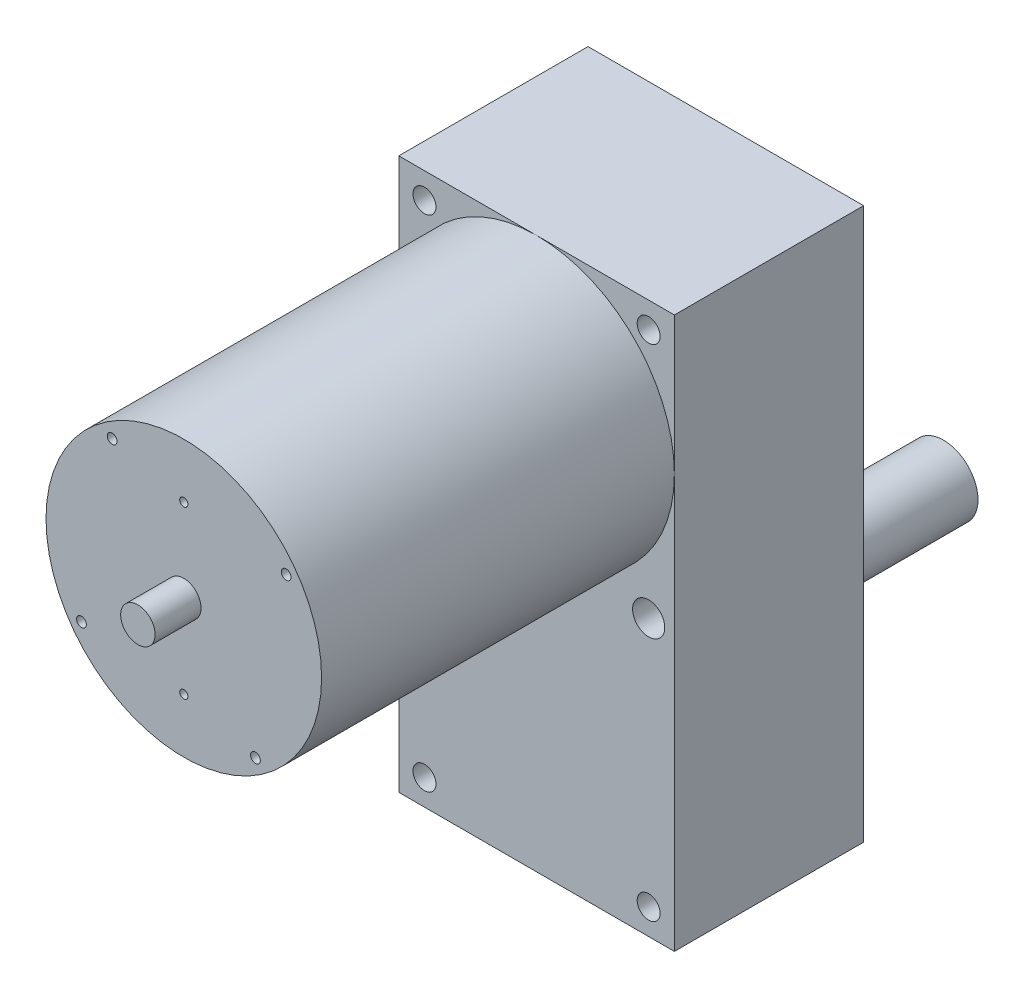
ISO-10303-21;
HEADER;
FILE_DESCRIPTION(('STEP AP214'),'2;1');
FILE_NAME('part.step','',(''),(''),'','','');
FILE_SCHEMA(('AUTOMOTIVE_DESIGN { 1 0 10303 214 1 1 1 1 }'));
ENDSEC;
DATA;
#1=APPLICATION_CONTEXT('core data for automotive mechanical design processes');
#2=APPLICATION_PROTOCOL_DEFINITION('international standard','automotive_design',2000,#1);
#3=PRODUCT_CONTEXT('',#1,'mechanical');
#4=PRODUCT('Part','Part','',(#3));
#5=PRODUCT_RELATED_PRODUCT_CATEGORY('part','',(#4));
#6=PRODUCT_DEFINITION_FORMATION('','',#4);
#7=PRODUCT_DEFINITION_CONTEXT('part definition',#1,'design');
#8=PRODUCT_DEFINITION('design','',#6,#7);
#9=PRODUCT_DEFINITION_SHAPE('','',#8);
#10=(LENGTH_UNIT() NAMED_UNIT(*) SI_UNIT(.MILLI.,.METRE.));
#11=(NAMED_UNIT(*) PLANE_ANGLE_UNIT() SI_UNIT($,.RADIAN.));
#12=(NAMED_UNIT(*) SI_UNIT($,.STERADIAN.) SOLID_ANGLE_UNIT());
#13=UNCERTAINTY_MEASURE_WITH_UNIT(LENGTH_MEASURE(1.E-05),#10,'distance_accuracy_value','');
#14=(GEOMETRIC_REPRESENTATION_CONTEXT(3) GLOBAL_UNCERTAINTY_ASSIGNED_CONTEXT((#13)) GLOBAL_UNIT_ASSIGNED_CONTEXT((#10,
#11,#12)) REPRESENTATION_CONTEXT('',''));
#15=CARTESIAN_POINT('',(0.,0.,0.));
#16=DIRECTION('',(0.,0.,1.));
#17=DIRECTION('',(1.,0.,0.));
#18=AXIS2_PLACEMENT_3D('',#15,#16,#17);
#19=CARTESIAN_POINT('',(0.,38.1000000000001,149.86));
#20=DIRECTION('',(0.,0.,1.));
#21=DIRECTION('',(1.,0.,0.));
#22=AXIS2_PLACEMENT_3D('',#19,#20,#21);
#23=PLANE('',#22);
#24=CARTESIAN_POINT('',(28.296788217919,57.9136244173105,149.86));
#25=DIRECTION('',(0.,0.,1.));
#26=DIRECTION('',(1.,0.,0.));
#27=AXIS2_PLACEMENT_3D('',#24,#25,#26);
#28=CIRCLE('',#27,1.35255);
#29=CARTESIAN_POINT('',(29.649338217919,57.9136244173105,149.86));
#30=VERTEX_POINT('',#29);
#31=EDGE_CURVE('E138',#30,#30,#28,.T.);
#32=ORIENTED_EDGE('',*,*,#31,.F.);
#33=EDGE_LOOP('',(#32));
#34=FACE_BOUND('',#33,.T.);
#35=CARTESIAN_POINT('',(19.8136244173104,9.80321178208109,149.86));
#36=DIRECTION('',(0.,0.,1.));
#37=DIRECTION('',(1.,0.,0.));
#38=AXIS2_PLACEMENT_3D('',#35,#36,#37);
#39=CIRCLE('',#38,1.35255);
#40=CARTESIAN_POINT('',(21.1661744173104,9.80321178208109,149.86));
#41=VERTEX_POINT('',#40);
#42=EDGE_CURVE('E137',#41,#41,#39,.T.);
#43=ORIENTED_EDGE('',*,*,#42,.F.);
#44=EDGE_LOOP('',(#43));
#45=FACE_BOUND('',#44,.T.);
#46=CARTESIAN_POINT('',(-28.296788217919,18.2863755826897,149.86));
#47=DIRECTION('',(0.,0.,1.));
#48=DIRECTION('',(1.,0.,0.));
#49=AXIS2_PLACEMENT_3D('',#46,#47,#48);
#50=CIRCLE('',#49,1.35255);
#51=CARTESIAN_POINT('',(-26.944238217919,18.2863755826897,149.86));
#52=VERTEX_POINT('',#51);
#53=EDGE_CURVE('E149',#52,#52,#50,.T.);
#54=ORIENTED_EDGE('',*,*,#53,.F.);
#55=EDGE_LOOP('',(#54));
#56=FACE_BOUND('',#55,.T.);
#57=CARTESIAN_POINT('',(-19.8136244173104,66.3967882179192,149.86));
#58=DIRECTION('',(0.,0.,1.));
#59=DIRECTION('',(1.,0.,0.));
#60=AXIS2_PLACEMENT_3D('',#57,#58,#59);
#61=CIRCLE('',#60,1.35255);
#62=CARTESIAN_POINT('',(-18.4610744173104,66.3967882179192,149.86));
#63=VERTEX_POINT('',#62);
#64=EDGE_CURVE('E155',#63,#63,#61,.T.);
#65=ORIENTED_EDGE('',*,*,#64,.F.);
#66=EDGE_LOOP('',(#65));
#67=FACE_BOUND('',#66,.T.);
#68=CARTESIAN_POINT('',(0.,61.1000000000001,149.86));
#69=DIRECTION('',(0.,0.,1.));
#70=DIRECTION('',(1.,0.,0.));
#71=AXIS2_PLACEMENT_3D('',#68,#69,#70);
#72=CIRCLE('',#71,1.1303);
#73=CARTESIAN_POINT('',(1.1303,61.1000000000001,149.86));
#74=VERTEX_POINT('',#73);
#75=EDGE_CURVE('E161',#74,#74,#72,.T.);
#76=ORIENTED_EDGE('',*,*,#75,.F.);
#77=EDGE_LOOP('',(#76));
#78=FACE_BOUND('',#77,.T.);
#79=CARTESIAN_POINT('',(0.,15.1000000000001,149.86));
#80=DIRECTION('',(0.,0.,1.));
#81=DIRECTION('',(1.,0.,0.));
#82=AXIS2_PLACEMENT_3D('',#79,#80,#81);
#83=CIRCLE('',#82,1.1303);
#84=CARTESIAN_POINT('',(1.1303,15.1000000000001,149.86));
#85=VERTEX_POINT('',#84);
#86=EDGE_CURVE('E167',#85,#85,#83,.T.);
#87=ORIENTED_EDGE('',*,*,#86,.F.);
#88=EDGE_LOOP('',(#87));
#89=FACE_BOUND('',#88,.T.);
#90=CARTESIAN_POINT('',(0.,38.1000000000001,149.86));
#91=DIRECTION('',(0.,0.,1.));
#92=DIRECTION('',(1.,0.,0.));
#93=AXIS2_PLACEMENT_3D('',#90,#91,#92);
#94=CIRCLE('',#93,38.1);
#95=CARTESIAN_POINT('',(38.1,38.1000000000001,149.86));
#96=VERTEX_POINT('',#95);
#97=EDGE_CURVE('E180',#96,#96,#94,.T.);
#98=ORIENTED_EDGE('',*,*,#97,.T.);
#99=EDGE_LOOP('',(#98));
#100=FACE_BOUND('',#99,.T.);
#101=CARTESIAN_POINT('',(0.,38.1000000000001,149.86));
#102=DIRECTION('',(0.,0.,1.));
#103=DIRECTION('',(1.,0.,0.));
#104=AXIS2_PLACEMENT_3D('',#101,#102,#103);
#105=CIRCLE('',#104,4.7625);
#106=CARTESIAN_POINT('',(4.7625,38.1000000000001,149.86));
#107=VERTEX_POINT('',#106);
#108=EDGE_CURVE('E174',#107,#107,#105,.T.);
#109=ORIENTED_EDGE('',*,*,#108,.F.);
#110=EDGE_LOOP('',(#109));
#111=FACE_BOUND('',#110,.T.);
#112=ADVANCED_FACE('F36',(#34,#45,#56,#67,#78,#89,#100,#111),#23,.T.);
#113=CARTESIAN_POINT('',(0.,-132.672478093894,52.324));
#114=DIRECTION('',(0.,0.,1.));
#115=DIRECTION('',(1.,0.,0.));
#116=AXIS2_PLACEMENT_3D('',#113,#114,#115);
#117=PLANE('',#116);
#118=CARTESIAN_POINT('',(0.,38.1000000000001,52.324));
#119=DIRECTION('',(0.,0.,1.));
#120=DIRECTION('',(1.,0.,0.));
#121=AXIS2_PLACEMENT_3D('',#118,#119,#120);
#122=CIRCLE('',#121,38.1);
#123=CARTESIAN_POINT('',(38.1,38.1000000000002,52.324));
#124=VERTEX_POINT('',#123);
#125=CARTESIAN_POINT('',(0.,76.2000000000001,52.324));
#126=VERTEX_POINT('',#125);
#127=EDGE_CURVE('E47',#124,#126,#122,.T.);
#128=ORIENTED_EDGE('',*,*,#127,.F.);
#129=DIRECTION('',(0.,1.,0.));
#130=VECTOR('',#129,1.);
#131=CARTESIAN_POINT('',(38.1000000000001,-132.672478093894,52.324));
#132=LINE('',#131,#130);
#133=CARTESIAN_POINT('',(38.1,76.2000000000001,52.324));
#134=VERTEX_POINT('',#133);
#135=EDGE_CURVE('E254',#124,#134,#132,.T.);
#136=ORIENTED_EDGE('',*,*,#135,.T.);
#137=DIRECTION('',(-1.,0.,0.));
#138=VECTOR('',#137,1.);
#139=CARTESIAN_POINT('',(0.,76.2000000000001,52.324));
#140=LINE('',#139,#138);
#141=EDGE_CURVE('E259',#134,#126,#140,.T.);
#142=ORIENTED_EDGE('',*,*,#141,.T.);
#143=EDGE_LOOP('',(#128,#136,#142));
#144=FACE_BOUND('',#143,.T.);
#145=CARTESIAN_POINT('',(30.988,69.088,52.324));
#146=DIRECTION('',(0.,0.,1.));
#147=DIRECTION('',(1.,0.,0.));
#148=AXIS2_PLACEMENT_3D('',#145,#146,#147);
#149=CIRCLE('',#148,3.175);
#150=CARTESIAN_POINT('',(34.163,69.088,52.324));
#151=VERTEX_POINT('',#150);
#152=EDGE_CURVE('E269',#151,#151,#149,.F.);
#153=ORIENTED_EDGE('',*,*,#152,.T.);
#154=EDGE_LOOP('',(#153));
#155=FACE_BOUND('',#154,.T.);
#156=ADVANCED_FACE('F319',(#144,#155),#117,.T.);
#157=CARTESIAN_POINT('',(-38.1,38.1000000000001,52.324));
#158=VERTEX_POINT('',#157);
#159=EDGE_CURVE('E11',#126,#158,#122,.T.);
#160=ORIENTED_EDGE('',*,*,#159,.F.);
#161=CARTESIAN_POINT('',(-38.1,76.2000000000001,52.324));
#162=VERTEX_POINT('',#161);
#163=EDGE_CURVE('E258',#126,#162,#140,.T.);
#164=ORIENTED_EDGE('',*,*,#163,.T.);
#165=DIRECTION('',(0.,1.,0.));
#166=VECTOR('',#165,1.);
#167=CARTESIAN_POINT('',(-38.1,-132.672478093894,52.324));
#168=LINE('',#167,#166);
#169=EDGE_CURVE('E247',#158,#162,#168,.T.);
#170=ORIENTED_EDGE('',*,*,#169,.F.);
#171=EDGE_LOOP('',(#160,#164,#170));
#172=FACE_BOUND('',#171,.T.);
#173=CARTESIAN_POINT('',(-30.988,69.088,52.324));
#174=DIRECTION('',(0.,0.,1.));
#175=DIRECTION('',(1.,0.,0.));
#176=AXIS2_PLACEMENT_3D('',#173,#174,#175);
#177=CIRCLE('',#176,3.175);
#178=CARTESIAN_POINT('',(-27.813,69.088,52.324));
#179=VERTEX_POINT('',#178);
#180=EDGE_CURVE('E240',#179,#179,#177,.T.);
#181=ORIENTED_EDGE('',*,*,#180,.F.);
#182=EDGE_LOOP('',(#181));
#183=FACE_BOUND('',#182,.T.);
#184=ADVANCED_FACE('F341',(#172,#183),#117,.T.);
#185=CARTESIAN_POINT('',(-38.1,-132.672478093894,52.324));
#186=DIRECTION('',(-1.,0.,0.));
#187=DIRECTION('',(0.,-1.,0.));
#188=AXIS2_PLACEMENT_3D('',#185,#186,#187);
#189=PLANE('',#188);
#190=DIRECTION('',(0.,1.,0.));
#191=VECTOR('',#190,1.);
#192=CARTESIAN_POINT('',(-38.1,-132.672478093894,0.));
#193=LINE('',#192,#191);
#194=CARTESIAN_POINT('',(-38.1,-76.1999999999999,0.));
#195=VERTEX_POINT('',#194);
#196=CARTESIAN_POINT('',(-38.1,76.2000000000001,0.));
#197=VERTEX_POINT('',#196);
#198=EDGE_CURVE('E281',#195,#197,#193,.T.);
#199=ORIENTED_EDGE('',*,*,#198,.F.);
#200=DIRECTION('',(0.,0.,-1.));
#201=VECTOR('',#200,1.);
#202=CARTESIAN_POINT('',(-38.1,-76.1999999999999,52.324));
#203=LINE('',#202,#201);
#204=CARTESIAN_POINT('',(-38.1,-76.1999999999999,52.324));
#205=VERTEX_POINT('',#204);
#206=EDGE_CURVE('E308',#205,#195,#203,.T.);
#207=ORIENTED_EDGE('',*,*,#206,.F.);
#208=EDGE_CURVE('E248',#205,#158,#168,.T.);
#209=ORIENTED_EDGE('',*,*,#208,.T.);
#210=ORIENTED_EDGE('',*,*,#169,.T.);
#211=DIRECTION('',(0.,0.,-1.));
#212=VECTOR('',#211,1.);
#213=CARTESIAN_POINT('',(-38.1,76.2000000000001,52.324));
#214=LINE('',#213,#212);
#215=EDGE_CURVE('E272',#162,#197,#214,.T.);
#216=ORIENTED_EDGE('',*,*,#215,.T.);
#217=EDGE_LOOP('',(#199,#207,#209,#210,#216));
#218=FACE_BOUND('',#217,.T.);
#219=ADVANCED_FACE('F340',(#218),#189,.T.);
#220=CARTESIAN_POINT('',(0.,-76.1999999999999,52.324));
#221=DIRECTION('',(0.,-1.,0.));
#222=DIRECTION('',(1.,0.,0.));
#223=AXIS2_PLACEMENT_3D('',#220,#221,#222);
#224=PLANE('',#223);
#225=DIRECTION('',(-1.,0.,0.));
#226=VECTOR('',#225,1.);
#227=CARTESIAN_POINT('',(0.,-76.1999999999999,0.));
#228=LINE('',#227,#226);
#229=CARTESIAN_POINT('',(38.1000000000001,-76.1999999999999,0.));
#230=VERTEX_POINT('',#229);
#231=EDGE_CURVE('E285',#230,#195,#228,.T.);
#232=ORIENTED_EDGE('',*,*,#231,.F.);
#233=DIRECTION('',(0.,0.,-1.));
#234=VECTOR('',#233,1.);
#235=CARTESIAN_POINT('',(38.1000000000001,-76.1999999999999,52.324));
#236=LINE('',#235,#234);
#237=CARTESIAN_POINT('',(38.1000000000001,-76.1999999999999,52.324));
#238=VERTEX_POINT('',#237);
#239=EDGE_CURVE('E307',#238,#230,#236,.T.);
#240=ORIENTED_EDGE('',*,*,#239,.F.);
#241=DIRECTION('',(-1.,0.,0.));
#242=VECTOR('',#241,1.);
#243=CARTESIAN_POINT('',(0.,-76.1999999999999,52.324));
#244=LINE('',#243,#242);
#245=EDGE_CURVE('E251',#238,#205,#244,.T.);
#246=ORIENTED_EDGE('',*,*,#245,.T.);
#247=ORIENTED_EDGE('',*,*,#206,.T.);
#248=EDGE_LOOP('',(#232,#240,#246,#247));
#249=FACE_BOUND('',#248,.T.);
#250=ADVANCED_FACE('F334',(#249),#224,.T.);
#251=CARTESIAN_POINT('',(38.1000000000001,-132.672478093894,52.324));
#252=DIRECTION('',(-1.,0.,0.));
#253=DIRECTION('',(0.,-1.,0.));
#254=AXIS2_PLACEMENT_3D('',#251,#252,#253);
#255=PLANE('',#254);
#256=DIRECTION('',(0.,1.,0.));
#257=VECTOR('',#256,1.);
#258=CARTESIAN_POINT('',(38.1000000000001,-132.672478093894,0.));
#259=LINE('',#258,#257);
#260=CARTESIAN_POINT('',(38.1,76.2000000000001,0.));
#261=VERTEX_POINT('',#260);
#262=EDGE_CURVE('E288',#230,#261,#259,.T.);
#263=ORIENTED_EDGE('',*,*,#262,.T.);
#264=DIRECTION('',(0.,0.,-1.));
#265=VECTOR('',#264,1.);
#266=CARTESIAN_POINT('',(38.1,76.2000000000001,52.324));
#267=LINE('',#266,#265);
#268=EDGE_CURVE('E304',#134,#261,#267,.T.);
#269=ORIENTED_EDGE('',*,*,#268,.F.);
#270=ORIENTED_EDGE('',*,*,#135,.F.);
#271=EDGE_CURVE('E255',#238,#124,#132,.T.);
#272=ORIENTED_EDGE('',*,*,#271,.F.);
#273=ORIENTED_EDGE('',*,*,#239,.T.);
#274=EDGE_LOOP('',(#263,#269,#270,#272,#273));
#275=FACE_BOUND('',#274,.T.);
#276=ADVANCED_FACE('F328',(#275),#255,.F.);
#277=CARTESIAN_POINT('',(30.994242085719,-69.088,52.324));
#278=DIRECTION('',(0.,0.,-1.));
#279=DIRECTION('',(-1.,0.,0.));
#280=AXIS2_PLACEMENT_3D('',#277,#278,#279);
#281=CYLINDRICAL_SURFACE('',#280,3.175);
#282=CARTESIAN_POINT('',(30.994242085719,-69.088,52.324));
#283=DIRECTION('',(0.,0.,1.));
#284=DIRECTION('',(1.,0.,0.));
#285=AXIS2_PLACEMENT_3D('',#282,#283,#284);
#286=CIRCLE('',#285,3.175);
#287=CARTESIAN_POINT('',(34.169242085719,-69.088,52.324));
#288=VERTEX_POINT('',#287);
#289=EDGE_CURVE('E266',#288,#288,#286,.F.);
#290=ORIENTED_EDGE('',*,*,#289,.F.);
#291=EDGE_LOOP('',(#290));
#292=FACE_BOUND('',#291,.T.);
#293=CARTESIAN_POINT('',(30.994242085719,-69.088,0.));
#294=DIRECTION('',(0.,0.,1.));
#295=DIRECTION('',(1.,0.,0.));
#296=AXIS2_PLACEMENT_3D('',#293,#294,#295);
#297=CIRCLE('',#296,3.175);
#298=CARTESIAN_POINT('',(34.169242085719,-69.088,0.));
#299=VERTEX_POINT('',#298);
#300=EDGE_CURVE('E298',#299,#299,#297,.F.);
#301=ORIENTED_EDGE('',*,*,#300,.T.);
#302=EDGE_LOOP('',(#301));
#303=FACE_BOUND('',#302,.T.);
#304=ADVANCED_FACE('F433',(#292,#303),#281,.F.);
#305=CARTESIAN_POINT('',(-30.988,0.,52.324));
#306=DIRECTION('',(0.,0.,-1.));
#307=DIRECTION('',(-1.,0.,0.));
#308=AXIS2_PLACEMENT_3D('',#305,#306,#307);
#309=CYLINDRICAL_SURFACE('',#308,4.445);
#310=CARTESIAN_POINT('',(-30.988,0.,52.324));
#311=DIRECTION('',(0.,0.,1.));
#312=DIRECTION('',(1.,0.,0.));
#313=AXIS2_PLACEMENT_3D('',#310,#311,#312);
#314=CIRCLE('',#313,4.445);
#315=CARTESIAN_POINT('',(-26.543,0.,52.324));
#316=VERTEX_POINT('',#315);
#317=EDGE_CURVE('E262',#316,#316,#314,.T.);
#318=ORIENTED_EDGE('',*,*,#317,.T.);
#319=EDGE_LOOP('',(#318));
#320=FACE_BOUND('',#319,.T.);
#321=CARTESIAN_POINT('',(-30.988,0.,0.));
#322=DIRECTION('',(0.,0.,1.));
#323=DIRECTION('',(1.,0.,0.));
#324=AXIS2_PLACEMENT_3D('',#321,#322,#323);
#325=CIRCLE('',#324,4.445);
#326=CARTESIAN_POINT('',(-26.543,0.,0.));
#327=VERTEX_POINT('',#326);
#328=EDGE_CURVE('E294',#327,#327,#325,.T.);
#329=ORIENTED_EDGE('',*,*,#328,.F.);
#330=EDGE_LOOP('',(#329));
#331=FACE_BOUND('',#330,.T.);
#332=ADVANCED_FACE('F367',(#320,#331),#309,.F.);
#333=CARTESIAN_POINT('',(0.,76.2000000000001,52.324));
#334=DIRECTION('',(0.,-1.,0.));
#335=DIRECTION('',(1.,0.,0.));
#336=AXIS2_PLACEMENT_3D('',#333,#334,#335);
#337=PLANE('',#336);
#338=DIRECTION('',(-1.,0.,0.));
#339=VECTOR('',#338,1.);
#340=CARTESIAN_POINT('',(0.,76.2000000000001,0.));
#341=LINE('',#340,#339);
#342=EDGE_CURVE('E291',#261,#197,#341,.T.);
#343=ORIENTED_EDGE('',*,*,#342,.T.);
#344=ORIENTED_EDGE('',*,*,#215,.F.);
#345=ORIENTED_EDGE('',*,*,#163,.F.);
#346=ORIENTED_EDGE('',*,*,#141,.F.);
#347=ORIENTED_EDGE('',*,*,#268,.T.);
#348=EDGE_LOOP('',(#343,#344,#345,#346,#347));
#349=FACE_BOUND('',#348,.T.);
#350=ADVANCED_FACE('F325',(#349),#337,.F.);
#351=CARTESIAN_POINT('',(-30.994242085719,-69.088,52.324));
#352=DIRECTION('',(0.,0.,-1.));
#353=DIRECTION('',(-1.,0.,0.));
#354=AXIS2_PLACEMENT_3D('',#351,#352,#353);
#355=CYLINDRICAL_SURFACE('',#354,3.175);
#356=CARTESIAN_POINT('',(-30.994242085719,-69.088,52.324));
#357=DIRECTION('',(0.,0.,1.));
#358=DIRECTION('',(1.,0.,0.));
#359=AXIS2_PLACEMENT_3D('',#356,#357,#358);
#360=CIRCLE('',#359,3.175);
#361=CARTESIAN_POINT('',(-27.819242085719,-69.088,52.324));
#362=VERTEX_POINT('',#361);
#363=EDGE_CURVE('E244',#362,#362,#360,.T.);
#364=ORIENTED_EDGE('',*,*,#363,.T.);
#365=EDGE_LOOP('',(#364));
#366=FACE_BOUND('',#365,.T.);
#367=CARTESIAN_POINT('',(-30.994242085719,-69.088,0.));
#368=DIRECTION('',(0.,0.,1.));
#369=DIRECTION('',(1.,0.,0.));
#370=AXIS2_PLACEMENT_3D('',#367,#368,#369);
#371=CIRCLE('',#370,3.175);
#372=CARTESIAN_POINT('',(-27.819242085719,-69.088,0.));
#373=VERTEX_POINT('',#372);
#374=EDGE_CURVE('E278',#373,#373,#371,.T.);
#375=ORIENTED_EDGE('',*,*,#374,.F.);
#376=EDGE_LOOP('',(#375));
#377=FACE_BOUND('',#376,.T.);
#378=ADVANCED_FACE('F350',(#366,#377),#355,.F.);
#379=CARTESIAN_POINT('',(-30.988,69.088,52.324));
#380=DIRECTION('',(0.,0.,-1.));
#381=DIRECTION('',(-1.,0.,0.));
#382=AXIS2_PLACEMENT_3D('',#379,#380,#381);
#383=CYLINDRICAL_SURFACE('',#382,3.175);
#384=ORIENTED_EDGE('',*,*,#180,.T.);
#385=EDGE_LOOP('',(#384));
#386=FACE_BOUND('',#385,.T.);
#387=CARTESIAN_POINT('',(-30.988,69.088,0.));
#388=DIRECTION('',(0.,0.,1.));
#389=DIRECTION('',(1.,0.,0.));
#390=AXIS2_PLACEMENT_3D('',#387,#388,#389);
#391=CIRCLE('',#390,3.175);
#392=CARTESIAN_POINT('',(-27.813,69.088,0.));
#393=VERTEX_POINT('',#392);
#394=EDGE_CURVE('E275',#393,#393,#391,.T.);
#395=ORIENTED_EDGE('',*,*,#394,.F.);
#396=EDGE_LOOP('',(#395));
#397=FACE_BOUND('',#396,.T.);
#398=ADVANCED_FACE('F347',(#386,#397),#383,.F.);
#399=CARTESIAN_POINT('',(30.988,0.,52.324));
#400=DIRECTION('',(0.,0.,-1.));
#401=DIRECTION('',(-1.,0.,0.));
#402=AXIS2_PLACEMENT_3D('',#399,#400,#401);
#403=CYLINDRICAL_SURFACE('',#402,4.445);
#404=CARTESIAN_POINT('',(30.988,0.,52.324));
#405=DIRECTION('',(0.,0.,1.));
#406=DIRECTION('',(1.,0.,0.));
#407=AXIS2_PLACEMENT_3D('',#404,#405,#406);
#408=CIRCLE('',#407,4.445);
#409=CARTESIAN_POINT('',(35.433,0.,52.324));
#410=VERTEX_POINT('',#409);
#411=EDGE_CURVE('E236',#410,#410,#408,.F.);
#412=ORIENTED_EDGE('',*,*,#411,.F.);
#413=EDGE_LOOP('',(#412));
#414=FACE_BOUND('',#413,.T.);
#415=CARTESIAN_POINT('',(30.988,0.,0.));
#416=DIRECTION('',(0.,0.,1.));
#417=DIRECTION('',(1.,0.,0.));
#418=AXIS2_PLACEMENT_3D('',#415,#416,#417);
#419=CIRCLE('',#418,4.445);
#420=CARTESIAN_POINT('',(35.433,0.,0.));
#421=VERTEX_POINT('',#420);
#422=EDGE_CURVE('E233',#421,#421,#419,.F.);
#423=ORIENTED_EDGE('',*,*,#422,.T.);
#424=EDGE_LOOP('',(#423));
#425=FACE_BOUND('',#424,.T.);
#426=ADVANCED_FACE('F38',(#414,#425),#403,.F.);
#427=CARTESIAN_POINT('',(30.988,69.088,52.324));
#428=DIRECTION('',(0.,0.,-1.));
#429=DIRECTION('',(-1.,0.,0.));
#430=AXIS2_PLACEMENT_3D('',#427,#428,#429);
#431=CYLINDRICAL_SURFACE('',#430,3.175);
#432=ORIENTED_EDGE('',*,*,#152,.F.);
#433=EDGE_LOOP('',(#432));
#434=FACE_BOUND('',#433,.T.);
#435=CARTESIAN_POINT('',(30.988,69.088,0.));
#436=DIRECTION('',(0.,0.,1.));
#437=DIRECTION('',(1.,0.,0.));
#438=AXIS2_PLACEMENT_3D('',#435,#436,#437);
#439=CIRCLE('',#438,3.175);
#440=CARTESIAN_POINT('',(34.163,69.088,0.));
#441=VERTEX_POINT('',#440);
#442=EDGE_CURVE('E241',#441,#441,#439,.F.);
#443=ORIENTED_EDGE('',*,*,#442,.T.);
#444=EDGE_LOOP('',(#443));
#445=FACE_BOUND('',#444,.T.);
#446=ADVANCED_FACE('F428',(#434,#445),#431,.F.);
#447=EDGE_CURVE('E45',#158,#124,#122,.T.);
#448=ORIENTED_EDGE('',*,*,#447,.F.);
#449=ORIENTED_EDGE('',*,*,#208,.F.);
#450=ORIENTED_EDGE('',*,*,#245,.F.);
#451=ORIENTED_EDGE('',*,*,#271,.T.);
#452=EDGE_LOOP('',(#448,#449,#450,#451));
#453=FACE_BOUND('',#452,.T.);
#454=ORIENTED_EDGE('',*,*,#411,.T.);
#455=EDGE_LOOP('',(#454));
#456=FACE_BOUND('',#455,.T.);
#457=ORIENTED_EDGE('',*,*,#363,.F.);
#458=EDGE_LOOP('',(#457));
#459=FACE_BOUND('',#458,.T.);
#460=ORIENTED_EDGE('',*,*,#317,.F.);
#461=EDGE_LOOP('',(#460));
#462=FACE_BOUND('',#461,.T.);
#463=ORIENTED_EDGE('',*,*,#289,.T.);
#464=EDGE_LOOP('',(#463));
#465=FACE_BOUND('',#464,.T.);
#466=ADVANCED_FACE('F336',(#453,#456,#459,#462,#465),#117,.T.);
#467=CARTESIAN_POINT('',(0.,-132.672478093894,0.));
#468=DIRECTION('',(0.,0.,1.));
#469=DIRECTION('',(1.,0.,0.));
#470=AXIS2_PLACEMENT_3D('',#467,#468,#469);
#471=PLANE('',#470);
#472=CARTESIAN_POINT('',(0.,-38.608,0.));
#473=DIRECTION('',(0.,0.,1.));
#474=DIRECTION('',(1.,0.,0.));
#475=AXIS2_PLACEMENT_3D('',#472,#473,#474);
#476=CIRCLE('',#475,23.495);
#477=CARTESIAN_POINT('',(23.495,-38.608,0.));
#478=VERTEX_POINT('',#477);
#479=EDGE_CURVE('E223',#478,#478,#476,.T.);
#480=ORIENTED_EDGE('',*,*,#479,.T.);
#481=EDGE_LOOP('',(#480));
#482=FACE_BOUND('',#481,.T.);
#483=CARTESIAN_POINT('',(0.,38.608,0.));
#484=DIRECTION('',(0.,0.,1.));
#485=DIRECTION('',(1.,0.,0.));
#486=AXIS2_PLACEMENT_3D('',#483,#484,#485);
#487=CIRCLE('',#486,23.495);
#488=CARTESIAN_POINT('',(23.495,38.608,0.));
#489=VERTEX_POINT('',#488);
#490=EDGE_CURVE('E227',#489,#489,#487,.T.);
#491=ORIENTED_EDGE('',*,*,#490,.T.);
#492=EDGE_LOOP('',(#491));
#493=FACE_BOUND('',#492,.T.);
#494=ORIENTED_EDGE('',*,*,#422,.F.);
#495=EDGE_LOOP('',(#494));
#496=FACE_BOUND('',#495,.T.);
#497=ORIENTED_EDGE('',*,*,#394,.T.);
#498=EDGE_LOOP('',(#497));
#499=FACE_BOUND('',#498,.T.);
#500=ORIENTED_EDGE('',*,*,#374,.T.);
#501=EDGE_LOOP('',(#500));
#502=FACE_BOUND('',#501,.T.);
#503=ORIENTED_EDGE('',*,*,#198,.T.);
#504=ORIENTED_EDGE('',*,*,#342,.F.);
#505=ORIENTED_EDGE('',*,*,#262,.F.);
#506=ORIENTED_EDGE('',*,*,#231,.T.);
#507=EDGE_LOOP('',(#503,#504,#505,#506));
#508=FACE_BOUND('',#507,.T.);
#509=ORIENTED_EDGE('',*,*,#328,.T.);
#510=EDGE_LOOP('',(#509));
#511=FACE_BOUND('',#510,.T.);
#512=ORIENTED_EDGE('',*,*,#300,.F.);
#513=EDGE_LOOP('',(#512));
#514=FACE_BOUND('',#513,.T.);
#515=ORIENTED_EDGE('',*,*,#442,.F.);
#516=EDGE_LOOP('',(#515));
#517=FACE_BOUND('',#516,.T.);
#518=ADVANCED_FACE('F332',(#482,#493,#496,#499,#502,#508,#511,#514,#517),#471,.F.);
#519=CARTESIAN_POINT('',(0.,38.608,-4.826));
#520=DIRECTION('',(0.,0.,1.));
#521=DIRECTION('',(1.,0.,0.));
#522=AXIS2_PLACEMENT_3D('',#519,#520,#521);
#523=CYLINDRICAL_SURFACE('',#522,23.495);
#524=CARTESIAN_POINT('',(0.,38.608,-4.826));
#525=DIRECTION('',(0.,0.,1.));
#526=DIRECTION('',(1.,0.,0.));
#527=AXIS2_PLACEMENT_3D('',#524,#525,#526);
#528=CIRCLE('',#527,23.495);
#529=CARTESIAN_POINT('',(23.495,38.608,-4.826));
#530=VERTEX_POINT('',#529);
#531=EDGE_CURVE('E230',#530,#530,#528,.T.);
#532=ORIENTED_EDGE('',*,*,#531,.T.);
#533=EDGE_LOOP('',(#532));
#534=FACE_BOUND('',#533,.T.);
#535=ORIENTED_EDGE('',*,*,#490,.F.);
#536=EDGE_LOOP('',(#535));
#537=FACE_BOUND('',#536,.T.);
#538=ADVANCED_FACE('F355',(#534,#537),#523,.T.);
#539=CARTESIAN_POINT('',(0.,-132.672478093894,-4.826));
#540=DIRECTION('',(0.,0.,1.));
#541=DIRECTION('',(1.,0.,0.));
#542=AXIS2_PLACEMENT_3D('',#539,#540,#541);
#543=PLANE('',#542);
#544=ORIENTED_EDGE('',*,*,#531,.F.);
#545=EDGE_LOOP('',(#544));
#546=FACE_BOUND('',#545,.T.);
#547=ADVANCED_FACE('F420',(#546),#543,.F.);
#548=CARTESIAN_POINT('',(0.,-38.608,-4.826));
#549=DIRECTION('',(0.,0.,1.));
#550=DIRECTION('',(1.,0.,0.));
#551=AXIS2_PLACEMENT_3D('',#548,#549,#550);
#552=CYLINDRICAL_SURFACE('',#551,23.495);
#553=CARTESIAN_POINT('',(0.,-38.608,-4.826));
#554=DIRECTION('',(0.,0.,1.));
#555=DIRECTION('',(1.,0.,0.));
#556=AXIS2_PLACEMENT_3D('',#553,#554,#555);
#557=CIRCLE('',#556,23.495);
#558=CARTESIAN_POINT('',(23.495,-38.608,-4.826));
#559=VERTEX_POINT('',#558);
#560=EDGE_CURVE('E224',#559,#559,#557,.T.);
#561=ORIENTED_EDGE('',*,*,#560,.T.);
#562=EDGE_LOOP('',(#561));
#563=FACE_BOUND('',#562,.T.);
#564=ORIENTED_EDGE('',*,*,#479,.F.);
#565=EDGE_LOOP('',(#564));
#566=FACE_BOUND('',#565,.T.);
#567=ADVANCED_FACE('F416',(#563,#566),#552,.T.);
#568=CARTESIAN_POINT('',(0.,-132.672478093894,-4.826));
#569=DIRECTION('',(0.,0.,1.));
#570=DIRECTION('',(1.,0.,0.));
#571=AXIS2_PLACEMENT_3D('',#568,#569,#570);
#572=PLANE('',#571);
#573=CARTESIAN_POINT('',(0.,-38.608,-4.826));
#574=DIRECTION('',(0.,0.,1.));
#575=DIRECTION('',(1.,0.,0.));
#576=AXIS2_PLACEMENT_3D('',#573,#574,#575);
#577=CIRCLE('',#576,9.525);
#578=CARTESIAN_POINT('',(9.525,-38.608,-4.826));
#579=VERTEX_POINT('',#578);
#580=EDGE_CURVE('E220',#579,#579,#577,.T.);
#581=ORIENTED_EDGE('',*,*,#580,.T.);
#582=EDGE_LOOP('',(#581));
#583=FACE_BOUND('',#582,.T.);
#584=ORIENTED_EDGE('',*,*,#560,.F.);
#585=EDGE_LOOP('',(#584));
#586=FACE_BOUND('',#585,.T.);
#587=ADVANCED_FACE('F409',(#583,#586),#572,.F.);
#588=CARTESIAN_POINT('',(0.,-38.608,-60.198));
#589=DIRECTION('',(0.,0.,1.));
#590=DIRECTION('',(1.,0.,0.));
#591=AXIS2_PLACEMENT_3D('',#588,#589,#590);
#592=CYLINDRICAL_SURFACE('',#591,9.525);
#593=DIRECTION('',(0.,0.,-1.));
#594=VECTOR('',#593,1.);
#595=CARTESIAN_POINT('',(-8.98025612106915,-41.783,-33.274));
#596=LINE('',#595,#594);
#597=CARTESIAN_POINT('',(-8.98025612106915,-41.783,-33.274));
#598=VERTEX_POINT('',#597);
#599=CARTESIAN_POINT('',(-8.98025612106915,-41.783,-60.198));
#600=VERTEX_POINT('',#599);
#601=EDGE_CURVE('E206',#598,#600,#596,.T.);
#602=ORIENTED_EDGE('',*,*,#601,.T.);
#603=CARTESIAN_POINT('',(0.,-38.608,-60.198));
#604=DIRECTION('',(0.,0.,1.));
#605=DIRECTION('',(1.,0.,0.));
#606=AXIS2_PLACEMENT_3D('',#603,#604,#605);
#607=CIRCLE('',#606,9.525);
#608=CARTESIAN_POINT('',(-8.98025612106915,-35.433,-60.198));
#609=VERTEX_POINT('',#608);
#610=EDGE_CURVE('E217',#600,#609,#607,.T.);
#611=ORIENTED_EDGE('',*,*,#610,.T.);
#612=DIRECTION('',(0.,0.,-1.));
#613=VECTOR('',#612,1.);
#614=CARTESIAN_POINT('',(-8.98025612106915,-35.433,-33.274));
#615=LINE('',#614,#613);
#616=CARTESIAN_POINT('',(-8.98025612106915,-35.433,-33.274));
#617=VERTEX_POINT('',#616);
#618=EDGE_CURVE('E199',#617,#609,#615,.T.);
#619=ORIENTED_EDGE('',*,*,#618,.F.);
#620=CARTESIAN_POINT('',(0.,-38.608,-33.274));
#621=DIRECTION('',(0.,0.,-1.));
#622=DIRECTION('',(1.,0.,0.));
#623=AXIS2_PLACEMENT_3D('',#620,#621,#622);
#624=CIRCLE('',#623,9.52500000000006);
#625=EDGE_CURVE('E186',#598,#617,#624,.T.);
#626=ORIENTED_EDGE('',*,*,#625,.F.);
#627=EDGE_LOOP('',(#602,#611,#619,#626));
#628=FACE_BOUND('',#627,.T.);
#629=ORIENTED_EDGE('',*,*,#580,.F.);
#630=EDGE_LOOP('',(#629));
#631=FACE_BOUND('',#630,.T.);
#632=ADVANCED_FACE('F406',(#628,#631),#592,.T.);
#633=CARTESIAN_POINT('',(0.,-38.608,-60.198));
#634=DIRECTION('',(0.,0.,1.));
#635=DIRECTION('',(1.,0.,0.));
#636=AXIS2_PLACEMENT_3D('',#633,#634,#635);
#637=CYLINDRICAL_SURFACE('',#636,3.96875);
#638=CARTESIAN_POINT('',(0.,-38.608,-60.198));
#639=DIRECTION('',(0.,0.,1.));
#640=DIRECTION('',(1.,0.,0.));
#641=AXIS2_PLACEMENT_3D('',#638,#639,#640);
#642=CIRCLE('',#641,3.96875);
#643=CARTESIAN_POINT('',(3.96875,-38.608,-60.198));
#644=VERTEX_POINT('',#643);
#645=EDGE_CURVE('E209',#644,#644,#642,.T.);
#646=CARTESIAN_POINT('',(0.,-38.608,0.));
#647=DIRECTION('',(0.,0.,1.));
#648=DIRECTION('',(1.,0.,0.));
#649=AXIS2_PLACEMENT_3D('',#646,#647,#648);
#650=CIRCLE('',#649,3.96875);
#651=CARTESIAN_POINT('',(3.96875,-38.608,0.));
#652=VERTEX_POINT('',#651);
#653=EDGE_CURVE('E40',#652,#652,#650,.T.);
#654=CARTESIAN_POINT('',(3.96875,-38.608,-60.198));
#655=CARTESIAN_POINT('',(3.96875,-38.608,-59.5709375));
#656=CARTESIAN_POINT('',(3.96875,-38.608,-58.943875));
#657=CARTESIAN_POINT('',(3.96875,-38.608,-57.68975));
#658=CARTESIAN_POINT('',(3.96875,-38.608,-57.0626875));
#659=CARTESIAN_POINT('',(3.96875,-38.608,-55.8085625));
#660=CARTESIAN_POINT('',(3.96875,-38.608,-55.1815));
#661=CARTESIAN_POINT('',(3.96875,-38.608,-53.927375));
#662=CARTESIAN_POINT('',(3.96875,-38.608,-53.3003125));
#663=CARTESIAN_POINT('',(3.96875,-38.608,-52.0461875));
#664=CARTESIAN_POINT('',(3.96875,-38.608,-51.419125));
#665=CARTESIAN_POINT('',(3.96875,-38.608,-50.165));
#666=CARTESIAN_POINT('',(3.96875,-38.608,-49.5379375));
#667=CARTESIAN_POINT('',(3.96875,-38.608,-48.2838125));
#668=CARTESIAN_POINT('',(3.96875,-38.608,-47.65675));
#669=CARTESIAN_POINT('',(3.96875,-38.608,-46.402625));
#670=CARTESIAN_POINT('',(3.96875,-38.608,-45.7755625));
#671=CARTESIAN_POINT('',(3.96875,-38.608,-44.5214375));
#672=CARTESIAN_POINT('',(3.96875,-38.608,-43.894375));
#673=CARTESIAN_POINT('',(3.96875,-38.608,-42.64025));
#674=CARTESIAN_POINT('',(3.96875,-38.608,-42.0131875));
#675=CARTESIAN_POINT('',(3.96875,-38.608,-40.7590625));
#676=CARTESIAN_POINT('',(3.96875,-38.608,-40.132));
#677=CARTESIAN_POINT('',(3.96875,-38.608,-38.877875));
#678=CARTESIAN_POINT('',(3.96875,-38.608,-38.2508125));
#679=CARTESIAN_POINT('',(3.96875,-38.608,-36.9966875));
#680=CARTESIAN_POINT('',(3.96875,-38.608,-36.369625));
#681=CARTESIAN_POINT('',(3.96875,-38.608,-35.1155));
#682=CARTESIAN_POINT('',(3.96875,-38.608,-34.4884375));
#683=CARTESIAN_POINT('',(3.96875,-38.608,-33.2343125));
#684=CARTESIAN_POINT('',(3.96875,-38.608,-32.60725));
#685=CARTESIAN_POINT('',(3.96875,-38.608,-31.353125));
#686=CARTESIAN_POINT('',(3.96875,-38.608,-30.7260625));
#687=CARTESIAN_POINT('',(3.96875,-38.608,-29.4719375));
#688=CARTESIAN_POINT('',(3.96875,-38.608,-28.844875));
#689=CARTESIAN_POINT('',(3.96875,-38.608,-27.59075));
#690=CARTESIAN_POINT('',(3.96875,-38.608,-26.9636875));
#691=CARTESIAN_POINT('',(3.96875,-38.608,-25.7095625));
#692=CARTESIAN_POINT('',(3.96875,-38.608,-25.0825));
#693=CARTESIAN_POINT('',(3.96875,-38.608,-23.828375));
#694=CARTESIAN_POINT('',(3.96875,-38.608,-23.2013125));
#695=CARTESIAN_POINT('',(3.96875,-38.608,-21.9471875));
#696=CARTESIAN_POINT('',(3.96875,-38.608,-21.320125));
#697=CARTESIAN_POINT('',(3.96875,-38.608,-20.066));
#698=CARTESIAN_POINT('',(3.96875,-38.608,-19.4389375));
#699=CARTESIAN_POINT('',(3.96875,-38.608,-18.1848125));
#700=CARTESIAN_POINT('',(3.96875,-38.608,-17.55775));
#701=CARTESIAN_POINT('',(3.96875,-38.608,-16.303625));
#702=CARTESIAN_POINT('',(3.96875,-38.608,-15.6765625));
#703=CARTESIAN_POINT('',(3.96875,-38.608,-14.4224375));
#704=CARTESIAN_POINT('',(3.96875,-38.608,-13.795375));
#705=CARTESIAN_POINT('',(3.96875,-38.608,-12.54125));
#706=CARTESIAN_POINT('',(3.96875,-38.608,-11.9141875));
#707=CARTESIAN_POINT('',(3.96875,-38.608,-10.6600625));
#708=CARTESIAN_POINT('',(3.96875,-38.608,-10.033));
#709=CARTESIAN_POINT('',(3.96875,-38.608,-8.77887500000001));
#710=CARTESIAN_POINT('',(3.96875,-38.608,-8.15181250000001));
#711=CARTESIAN_POINT('',(3.96875,-38.608,-6.8976875));
#712=CARTESIAN_POINT('',(3.96875,-38.608,-6.270625));
#713=CARTESIAN_POINT('',(3.96875,-38.608,-5.01650000000001));
#714=CARTESIAN_POINT('',(3.96875,-38.608,-4.3894375));
#715=CARTESIAN_POINT('',(3.96875,-38.608,-3.13531250000001));
#716=CARTESIAN_POINT('',(3.96875,-38.608,-2.50825000000001));
#717=CARTESIAN_POINT('',(3.96875,-38.608,-1.25412500000001));
#718=CARTESIAN_POINT('',(3.96875,-38.608,-0.627062500000006));
#719=CARTESIAN_POINT('',(3.96875,-38.608,0.));
#720=B_SPLINE_CURVE_WITH_KNOTS('',3,(#654,#655,#656,#657,#658,#659,#660,#661,#662,#663,#664,
#665,#666,#667,#668,#669,#670,#671,#672,#673,#674,#675,#676,#677,#678,#679,#680,#681,#682,#683,
#684,#685,#686,#687,#688,#689,#690,#691,#692,#693,#694,#695,#696,#697,#698,#699,#700,#701,#702,
#703,#704,#705,#706,#707,#708,#709,#710,#711,#712,#713,#714,#715,#716,#717,#718,#719),
.UNSPECIFIED.,.F.,.F.,(4,2,2,2,2,2,2,2,2,2,2,2,2,2,2,2,2,2,2,2,2,2,2,2,2,2,2,2,2,2,2,2,4),(0.,
1.8811875,3.762375,5.6435625,7.52475,9.4059375,11.287125,13.1683125,15.0495,16.9306875,
18.811875,20.6930625,22.57425,24.4554375,26.336625,28.2178125,30.099,31.9801875,33.861375,
35.7425625,37.62375,39.5049375,41.386125,43.2673125,45.1485,47.0296875,48.910875,50.7920625,
52.67325,54.5544375,56.435625,58.3168125,60.198),.UNSPECIFIED.);
#721=EDGE_CURVE('BSEAM404',#644,#652,#720,.T.);
#722=ORIENTED_EDGE('',*,*,#645,.F.);
#723=ORIENTED_EDGE('',*,*,#653,.T.);
#724=ORIENTED_EDGE('',*,*,#721,.T.);
#725=ORIENTED_EDGE('',*,*,#721,.F.);
#726=EDGE_LOOP('',(#722,#724,#723,#725));
#727=FACE_BOUND('',#726,.T.);
#728=ADVANCED_FACE('F404',(#727),#637,.F.);
#729=CARTESIAN_POINT('',(0.,-132.672478093894,-60.198));
#730=DIRECTION('',(0.,0.,1.));
#731=DIRECTION('',(1.,0.,0.));
#732=AXIS2_PLACEMENT_3D('',#729,#730,#731);
#733=PLANE('',#732);
#734=ORIENTED_EDGE('',*,*,#645,.T.);
#735=EDGE_LOOP('',(#734));
#736=FACE_BOUND('',#735,.T.);
#737=ORIENTED_EDGE('',*,*,#610,.F.);
#738=DIRECTION('',(-1.,0.,0.));
#739=VECTOR('',#738,1.);
#740=CARTESIAN_POINT('',(-8.98025612106915,-41.783,-60.198));
#741=LINE('',#740,#739);
#742=CARTESIAN_POINT('',(-4.42793835403911,-41.783,-60.198));
#743=VERTEX_POINT('',#742);
#744=EDGE_CURVE('E190',#743,#600,#741,.T.);
#745=ORIENTED_EDGE('',*,*,#744,.F.);
#746=DIRECTION('',(0.,-1.,0.));
#747=VECTOR('',#746,1.);
#748=CARTESIAN_POINT('',(-4.42793835403911,-35.433,-60.198));
#749=LINE('',#748,#747);
#750=CARTESIAN_POINT('',(-4.42793835403911,-35.433,-60.198));
#751=VERTEX_POINT('',#750);
#752=EDGE_CURVE('E202',#751,#743,#749,.T.);
#753=ORIENTED_EDGE('',*,*,#752,.F.);
#754=DIRECTION('',(1.,0.,0.));
#755=VECTOR('',#754,1.);
#756=CARTESIAN_POINT('',(-8.98025612106915,-35.433,-60.198));
#757=LINE('',#756,#755);
#758=EDGE_CURVE('E183',#609,#751,#757,.T.);
#759=ORIENTED_EDGE('',*,*,#758,.F.);
#760=EDGE_LOOP('',(#737,#745,#753,#759));
#761=FACE_BOUND('',#760,.T.);
#762=ADVANCED_FACE('F401',(#736,#761),#733,.F.);
#763=ORIENTED_EDGE('',*,*,#653,.F.);
#764=EDGE_LOOP('',(#763));
#765=FACE_BOUND('',#764,.T.);
#766=ADVANCED_FACE('F358',(#765),#471,.F.);
#767=CARTESIAN_POINT('',(-8.98025612106915,-41.783,-33.274));
#768=DIRECTION('',(0.,-1.,0.));
#769=DIRECTION('',(0.,0.,-1.));
#770=AXIS2_PLACEMENT_3D('',#767,#768,#769);
#771=PLANE('',#770);
#772=ORIENTED_EDGE('',*,*,#744,.T.);
#773=ORIENTED_EDGE('',*,*,#601,.F.);
#774=DIRECTION('',(-1.,0.,0.));
#775=VECTOR('',#774,1.);
#776=CARTESIAN_POINT('',(-8.98025612106915,-41.783,-33.274));
#777=LINE('',#776,#775);
#778=CARTESIAN_POINT('',(-4.42793835403911,-41.783,-33.274));
#779=VERTEX_POINT('',#778);
#780=EDGE_CURVE('E196',#779,#598,#777,.T.);
#781=ORIENTED_EDGE('',*,*,#780,.F.);
#782=DIRECTION('',(0.,0.,-1.));
#783=VECTOR('',#782,1.);
#784=CARTESIAN_POINT('',(-4.42793835403911,-41.783,-33.274));
#785=LINE('',#784,#783);
#786=EDGE_CURVE('E210',#779,#743,#785,.T.);
#787=ORIENTED_EDGE('',*,*,#786,.T.);
#788=EDGE_LOOP('',(#772,#773,#781,#787));
#789=FACE_BOUND('',#788,.T.);
#790=ADVANCED_FACE('F390',(#789),#771,.F.);
#791=CARTESIAN_POINT('',(-4.42793835403911,-35.433,-33.274));
#792=DIRECTION('',(1.,0.,0.));
#793=DIRECTION('',(0.,0.,-1.));
#794=AXIS2_PLACEMENT_3D('',#791,#792,#793);
#795=PLANE('',#794);
#796=ORIENTED_EDGE('',*,*,#752,.T.);
#797=ORIENTED_EDGE('',*,*,#786,.F.);
#798=DIRECTION('',(0.,-1.,0.));
#799=VECTOR('',#798,1.);
#800=CARTESIAN_POINT('',(-4.42793835403911,-35.433,-33.274));
#801=LINE('',#800,#799);
#802=CARTESIAN_POINT('',(-4.42793835403911,-35.433,-33.274));
#803=VERTEX_POINT('',#802);
#804=EDGE_CURVE('E193',#803,#779,#801,.T.);
#805=ORIENTED_EDGE('',*,*,#804,.F.);
#806=DIRECTION('',(0.,0.,-1.));
#807=VECTOR('',#806,1.);
#808=CARTESIAN_POINT('',(-4.42793835403911,-35.433,-33.274));
#809=LINE('',#808,#807);
#810=EDGE_CURVE('E212',#803,#751,#809,.T.);
#811=ORIENTED_EDGE('',*,*,#810,.T.);
#812=EDGE_LOOP('',(#796,#797,#805,#811));
#813=FACE_BOUND('',#812,.T.);
#814=ADVANCED_FACE('F393',(#813),#795,.F.);
#815=CARTESIAN_POINT('',(-8.98025612106915,-35.433,-33.274));
#816=DIRECTION('',(0.,1.,0.));
#817=DIRECTION('',(0.,0.,1.));
#818=AXIS2_PLACEMENT_3D('',#815,#816,#817);
#819=PLANE('',#818);
#820=ORIENTED_EDGE('',*,*,#758,.T.);
#821=ORIENTED_EDGE('',*,*,#810,.F.);
#822=DIRECTION('',(1.,0.,0.));
#823=VECTOR('',#822,1.);
#824=CARTESIAN_POINT('',(-8.98025612106915,-35.433,-33.274));
#825=LINE('',#824,#823);
#826=EDGE_CURVE('E189',#617,#803,#825,.T.);
#827=ORIENTED_EDGE('',*,*,#826,.F.);
#828=ORIENTED_EDGE('',*,*,#618,.T.);
#829=EDGE_LOOP('',(#820,#821,#827,#828));
#830=FACE_BOUND('',#829,.T.);
#831=ADVANCED_FACE('F388',(#830),#819,.F.);
#832=CARTESIAN_POINT('',(0.,-38.608,-33.274));
#833=DIRECTION('',(0.,0.,1.));
#834=DIRECTION('',(1.,0.,0.));
#835=AXIS2_PLACEMENT_3D('',#832,#833,#834);
#836=PLANE('',#835);
#837=ORIENTED_EDGE('',*,*,#625,.T.);
#838=ORIENTED_EDGE('',*,*,#826,.T.);
#839=ORIENTED_EDGE('',*,*,#804,.T.);
#840=ORIENTED_EDGE('',*,*,#780,.T.);
#841=EDGE_LOOP('',(#837,#838,#839,#840));
#842=FACE_BOUND('',#841,.T.);
#843=ADVANCED_FACE('F384',(#842),#836,.F.);
#844=CARTESIAN_POINT('',(0.,38.1000000000001,149.86));
#845=DIRECTION('',(0.,0.,-1.));
#846=DIRECTION('',(-1.,0.,0.));
#847=AXIS2_PLACEMENT_3D('',#844,#845,#846);
#848=CYLINDRICAL_SURFACE('',#847,38.1);
#849=ORIENTED_EDGE('',*,*,#97,.F.);
#850=EDGE_LOOP('',(#849));
#851=FACE_BOUND('',#850,.T.);
#852=ORIENTED_EDGE('',*,*,#127,.T.);
#853=ORIENTED_EDGE('',*,*,#159,.T.);
#854=ORIENTED_EDGE('',*,*,#447,.T.);
#855=EDGE_LOOP('',(#852,#853,#854));
#856=FACE_BOUND('',#855,.T.);
#857=ADVANCED_FACE('F316',(#851,#856),#848,.T.);
#858=CARTESIAN_POINT('',(0.,38.1000000000001,162.56));
#859=DIRECTION('',(0.,0.,-1.));
#860=DIRECTION('',(-1.,0.,0.));
#861=AXIS2_PLACEMENT_3D('',#858,#859,#860);
#862=CYLINDRICAL_SURFACE('',#861,4.7625);
#863=CARTESIAN_POINT('',(0.,38.1000000000001,162.56));
#864=DIRECTION('',(0.,0.,1.));
#865=DIRECTION('',(1.,0.,0.));
#866=AXIS2_PLACEMENT_3D('',#863,#864,#865);
#867=CIRCLE('',#866,4.7625);
#868=CARTESIAN_POINT('',(4.7625,38.1000000000001,162.56));
#869=VERTEX_POINT('',#868);
#870=EDGE_CURVE('E175',#869,#869,#867,.T.);
#871=ORIENTED_EDGE('',*,*,#870,.F.);
#872=EDGE_LOOP('',(#871));
#873=FACE_BOUND('',#872,.T.);
#874=ORIENTED_EDGE('',*,*,#108,.T.);
#875=EDGE_LOOP('',(#874));
#876=FACE_BOUND('',#875,.T.);
#877=ADVANCED_FACE('F380',(#873,#876),#862,.T.);
#878=CARTESIAN_POINT('',(0.,38.1000000000001,162.56));
#879=DIRECTION('',(0.,0.,1.));
#880=DIRECTION('',(1.,0.,0.));
#881=AXIS2_PLACEMENT_3D('',#878,#879,#880);
#882=PLANE('',#881);
#883=ORIENTED_EDGE('',*,*,#870,.T.);
#884=EDGE_LOOP('',(#883));
#885=FACE_BOUND('',#884,.T.);
#886=ADVANCED_FACE('F470',(#885),#882,.T.);
#887=CARTESIAN_POINT('',(0.,15.1000000000001,142.26));
#888=DIRECTION('',(0.,0.,1.));
#889=DIRECTION('',(1.,0.,0.));
#890=AXIS2_PLACEMENT_3D('',#887,#888,#889);
#891=CONICAL_SURFACE('',#890,1.1303,1.02974425867666);
#892=CARTESIAN_POINT('',(0.,15.1000000000001,141.580847242313));
#893=VERTEX_POINT('',#892);
#894=VERTEX_LOOP('',#893);
#895=FACE_BOUND('',#894,.T.);
#896=CARTESIAN_POINT('',(0.,15.1000000000001,142.26));
#897=DIRECTION('',(0.,0.,1.));
#898=DIRECTION('',(1.,0.,0.));
#899=AXIS2_PLACEMENT_3D('',#896,#897,#898);
#900=CIRCLE('',#899,1.1303);
#901=CARTESIAN_POINT('',(1.1303,15.1000000000001,142.26));
#902=VERTEX_POINT('',#901);
#903=EDGE_CURVE('E171',#902,#902,#900,.T.);
#904=ORIENTED_EDGE('',*,*,#903,.T.);
#905=EDGE_LOOP('',(#904));
#906=FACE_BOUND('',#905,.T.);
#907=ADVANCED_FACE('F476',(#895,#906),#891,.F.);
#908=CARTESIAN_POINT('',(0.,15.1000000000001,149.86));
#909=DIRECTION('',(0.,0.,1.));
#910=DIRECTION('',(1.,0.,0.));
#911=AXIS2_PLACEMENT_3D('',#908,#909,#910);
#912=CYLINDRICAL_SURFACE('',#911,1.1303);
#913=ORIENTED_EDGE('',*,*,#903,.F.);
#914=EDGE_LOOP('',(#913));
#915=FACE_BOUND('',#914,.T.);
#916=ORIENTED_EDGE('',*,*,#86,.T.);
#917=EDGE_LOOP('',(#916));
#918=FACE_BOUND('',#917,.T.);
#919=ADVANCED_FACE('F483',(#915,#918),#912,.F.);
#920=CARTESIAN_POINT('',(0.,61.1000000000001,142.26));
#921=DIRECTION('',(0.,0.,1.));
#922=DIRECTION('',(1.,0.,0.));
#923=AXIS2_PLACEMENT_3D('',#920,#921,#922);
#924=CONICAL_SURFACE('',#923,1.1303,1.02974425867666);
#925=CARTESIAN_POINT('',(0.,61.1000000000001,141.580847242313));
#926=VERTEX_POINT('',#925);
#927=VERTEX_LOOP('',#926);
#928=FACE_BOUND('',#927,.T.);
#929=CARTESIAN_POINT('',(0.,61.1000000000001,142.26));
#930=DIRECTION('',(0.,0.,1.));
#931=DIRECTION('',(1.,0.,0.));
#932=AXIS2_PLACEMENT_3D('',#929,#930,#931);
#933=CIRCLE('',#932,1.1303);
#934=CARTESIAN_POINT('',(1.1303,61.1000000000001,142.26));
#935=VERTEX_POINT('',#934);
#936=EDGE_CURVE('E164',#935,#935,#933,.T.);
#937=ORIENTED_EDGE('',*,*,#936,.T.);
#938=EDGE_LOOP('',(#937));
#939=FACE_BOUND('',#938,.T.);
#940=ADVANCED_FACE('F491',(#928,#939),#924,.F.);
#941=CARTESIAN_POINT('',(0.,61.1000000000001,149.86));
#942=DIRECTION('',(0.,0.,1.));
#943=DIRECTION('',(1.,0.,0.));
#944=AXIS2_PLACEMENT_3D('',#941,#942,#943);
#945=CYLINDRICAL_SURFACE('',#944,1.1303);
#946=ORIENTED_EDGE('',*,*,#936,.F.);
#947=EDGE_LOOP('',(#946));
#948=FACE_BOUND('',#947,.T.);
#949=ORIENTED_EDGE('',*,*,#75,.T.);
#950=EDGE_LOOP('',(#949));
#951=FACE_BOUND('',#950,.T.);
#952=ADVANCED_FACE('F499',(#948,#951),#945,.F.);
#953=CARTESIAN_POINT('',(-19.8136244173104,66.3967882179192,140.47));
#954=DIRECTION('',(0.,0.,1.));
#955=DIRECTION('',(1.,0.,0.));
#956=AXIS2_PLACEMENT_3D('',#953,#954,#955);
#957=CONICAL_SURFACE('',#956,1.35255,1.02974425867666);
#958=CARTESIAN_POINT('',(-19.8136244173104,66.3967882179192,139.657305969734));
#959=VERTEX_POINT('',#958);
#960=VERTEX_LOOP('',#959);
#961=FACE_BOUND('',#960,.T.);
#962=CARTESIAN_POINT('',(-19.8136244173104,66.3967882179192,140.47));
#963=DIRECTION('',(0.,0.,1.));
#964=DIRECTION('',(1.,0.,0.));
#965=AXIS2_PLACEMENT_3D('',#962,#963,#964);
#966=CIRCLE('',#965,1.35255);
#967=CARTESIAN_POINT('',(-18.4610744173104,66.3967882179192,140.47));
#968=VERTEX_POINT('',#967);
#969=EDGE_CURVE('E158',#968,#968,#966,.T.);
#970=ORIENTED_EDGE('',*,*,#969,.T.);
#971=EDGE_LOOP('',(#970));
#972=FACE_BOUND('',#971,.T.);
#973=ADVANCED_FACE('F507',(#961,#972),#957,.F.);
#974=CARTESIAN_POINT('',(-19.8136244173104,66.3967882179192,149.86));
#975=DIRECTION('',(0.,0.,1.));
#976=DIRECTION('',(1.,0.,0.));
#977=AXIS2_PLACEMENT_3D('',#974,#975,#976);
#978=CYLINDRICAL_SURFACE('',#977,1.35255);
#979=ORIENTED_EDGE('',*,*,#969,.F.);
#980=EDGE_LOOP('',(#979));
#981=FACE_BOUND('',#980,.T.);
#982=ORIENTED_EDGE('',*,*,#64,.T.);
#983=EDGE_LOOP('',(#982));
#984=FACE_BOUND('',#983,.T.);
#985=ADVANCED_FACE('F515',(#981,#984),#978,.F.);
#986=CARTESIAN_POINT('',(-28.296788217919,18.2863755826897,140.47));
#987=DIRECTION('',(0.,0.,1.));
#988=DIRECTION('',(1.,0.,0.));
#989=AXIS2_PLACEMENT_3D('',#986,#987,#988);
#990=CONICAL_SURFACE('',#989,1.35255,1.02974425867666);
#991=CARTESIAN_POINT('',(-28.296788217919,18.2863755826897,139.657305969734));
#992=VERTEX_POINT('',#991);
#993=VERTEX_LOOP('',#992);
#994=FACE_BOUND('',#993,.T.);
#995=CARTESIAN_POINT('',(-28.296788217919,18.2863755826897,140.47));
#996=DIRECTION('',(0.,0.,1.));
#997=DIRECTION('',(1.,0.,0.));
#998=AXIS2_PLACEMENT_3D('',#995,#996,#997);
#999=CIRCLE('',#998,1.35255);
#1000=CARTESIAN_POINT('',(-26.944238217919,18.2863755826897,140.47));
#1001=VERTEX_POINT('',#1000);
#1002=EDGE_CURVE('E152',#1001,#1001,#999,.T.);
#1003=ORIENTED_EDGE('',*,*,#1002,.T.);
#1004=EDGE_LOOP('',(#1003));
#1005=FACE_BOUND('',#1004,.T.);
#1006=ADVANCED_FACE('F523',(#994,#1005),#990,.F.);
#1007=CARTESIAN_POINT('',(-28.296788217919,18.2863755826897,149.86));
#1008=DIRECTION('',(0.,0.,1.));
#1009=DIRECTION('',(1.,0.,0.));
#1010=AXIS2_PLACEMENT_3D('',#1007,#1008,#1009);
#1011=CYLINDRICAL_SURFACE('',#1010,1.35255);
#1012=ORIENTED_EDGE('',*,*,#1002,.F.);
#1013=EDGE_LOOP('',(#1012));
#1014=FACE_BOUND('',#1013,.T.);
#1015=ORIENTED_EDGE('',*,*,#53,.T.);
#1016=EDGE_LOOP('',(#1015));
#1017=FACE_BOUND('',#1016,.T.);
#1018=ADVANCED_FACE('F531',(#1014,#1017),#1011,.F.);
#1019=CARTESIAN_POINT('',(19.8136244173104,9.80321178208109,140.47));
#1020=DIRECTION('',(0.,0.,1.));
#1021=DIRECTION('',(1.,0.,0.));
#1022=AXIS2_PLACEMENT_3D('',#1019,#1020,#1021);
#1023=CONICAL_SURFACE('',#1022,1.35255,1.02974425867666);
#1024=CARTESIAN_POINT('',(19.8136244173104,9.80321178208109,139.657305969734));
#1025=VERTEX_POINT('',#1024);
#1026=VERTEX_LOOP('',#1025);
#1027=FACE_BOUND('',#1026,.T.);
#1028=CARTESIAN_POINT('',(19.8136244173104,9.80321178208109,140.47));
#1029=DIRECTION('',(0.,0.,1.));
#1030=DIRECTION('',(1.,0.,0.));
#1031=AXIS2_PLACEMENT_3D('',#1028,#1029,#1030);
#1032=CIRCLE('',#1031,1.35255);
#1033=CARTESIAN_POINT('',(21.1661744173104,9.80321178208109,140.47));
#1034=VERTEX_POINT('',#1033);
#1035=EDGE_CURVE('E141',#1034,#1034,#1032,.T.);
#1036=ORIENTED_EDGE('',*,*,#1035,.T.);
#1037=EDGE_LOOP('',(#1036));
#1038=FACE_BOUND('',#1037,.T.);
#1039=ADVANCED_FACE('F539',(#1027,#1038),#1023,.F.);
#1040=CARTESIAN_POINT('',(19.8136244173104,9.80321178208109,149.86));
#1041=DIRECTION('',(0.,0.,1.));
#1042=DIRECTION('',(1.,0.,0.));
#1043=AXIS2_PLACEMENT_3D('',#1040,#1041,#1042);
#1044=CYLINDRICAL_SURFACE('',#1043,1.35255);
#1045=ORIENTED_EDGE('',*,*,#1035,.F.);
#1046=EDGE_LOOP('',(#1045));
#1047=FACE_BOUND('',#1046,.T.);
#1048=ORIENTED_EDGE('',*,*,#42,.T.);
#1049=EDGE_LOOP('',(#1048));
#1050=FACE_BOUND('',#1049,.T.);
#1051=ADVANCED_FACE('F131',(#1047,#1050),#1044,.F.);
#1052=CARTESIAN_POINT('',(28.296788217919,57.9136244173105,140.47));
#1053=DIRECTION('',(0.,0.,1.));
#1054=DIRECTION('',(1.,0.,0.));
#1055=AXIS2_PLACEMENT_3D('',#1052,#1053,#1054);
#1056=CONICAL_SURFACE('',#1055,1.35255,1.02974425867666);
#1057=CARTESIAN_POINT('',(28.296788217919,57.9136244173105,139.657305969734));
#1058=VERTEX_POINT('',#1057);
#1059=VERTEX_LOOP('',#1058);
#1060=FACE_BOUND('',#1059,.T.);
#1061=CARTESIAN_POINT('',(28.296788217919,57.9136244173105,140.47));
#1062=DIRECTION('',(0.,0.,1.));
#1063=DIRECTION('',(1.,0.,0.));
#1064=AXIS2_PLACEMENT_3D('',#1061,#1062,#1063);
#1065=CIRCLE('',#1064,1.35255);
#1066=CARTESIAN_POINT('',(29.649338217919,57.9136244173105,140.47));
#1067=VERTEX_POINT('',#1066);
#1068=EDGE_CURVE('E135',#1067,#1067,#1065,.T.);
#1069=ORIENTED_EDGE('',*,*,#1068,.T.);
#1070=EDGE_LOOP('',(#1069));
#1071=FACE_BOUND('',#1070,.T.);
#1072=ADVANCED_FACE('F127',(#1060,#1071),#1056,.F.);
#1073=CARTESIAN_POINT('',(28.296788217919,57.9136244173105,149.86));
#1074=DIRECTION('',(0.,0.,1.));
#1075=DIRECTION('',(1.,0.,0.));
#1076=AXIS2_PLACEMENT_3D('',#1073,#1074,#1075);
#1077=CYLINDRICAL_SURFACE('',#1076,1.35255);
#1078=ORIENTED_EDGE('',*,*,#1068,.F.);
#1079=EDGE_LOOP('',(#1078));
#1080=FACE_BOUND('',#1079,.T.);
#1081=ORIENTED_EDGE('',*,*,#31,.T.);
#1082=EDGE_LOOP('',(#1081));
#1083=FACE_BOUND('',#1082,.T.);
#1084=ADVANCED_FACE('F130',(#1080,#1083),#1077,.F.);
#1085=CLOSED_SHELL('',(#112,#156,#184,#219,#250,#276,#304,#332,#350,#378,#398,#426,#446,#466,
#518,#538,#547,#567,#587,#632,#728,#762,#766,#790,#814,#831,#843,#857,#877,#886,#907,#919,#940,
#952,#973,#985,#1006,#1018,#1039,#1051,#1072,#1084));
#1086=MANIFOLD_SOLID_BREP('B2',#1085);
#1087=ADVANCED_BREP_SHAPE_REPRESENTATION('',(#18,#1086),#14);
#1088=SHAPE_DEFINITION_REPRESENTATION(#9,#1087);
ENDSEC;
END-ISO-10303-21;
